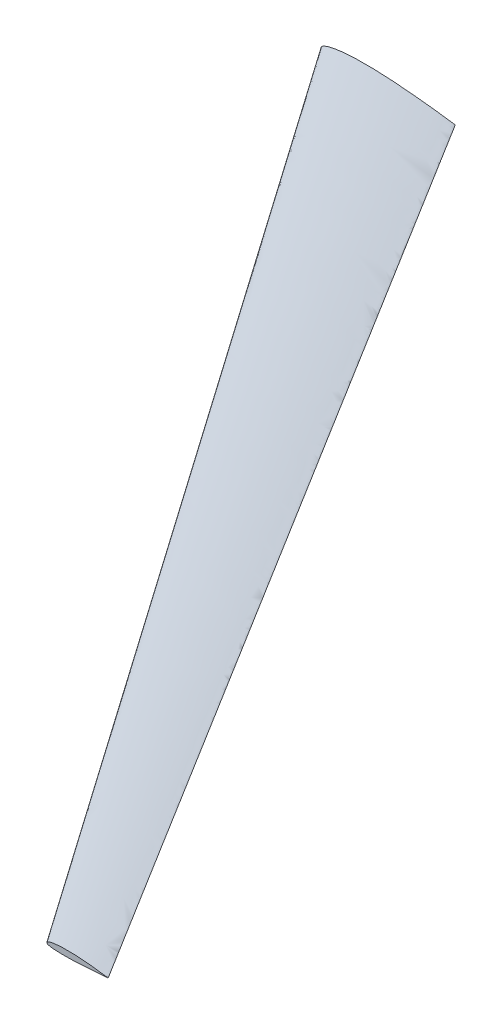
ISO-10303-21;
HEADER;
FILE_DESCRIPTION(('STEP AP214'),'2;1');
FILE_NAME('part.step','',(''),(''),'','','');
FILE_SCHEMA(('AUTOMOTIVE_DESIGN { 1 0 10303 214 1 1 1 1 }'));
ENDSEC;
DATA;
#1=APPLICATION_CONTEXT('core data for automotive mechanical design processes');
#2=APPLICATION_PROTOCOL_DEFINITION('international standard','automotive_design',2000,#1);
#3=PRODUCT_CONTEXT('',#1,'mechanical');
#4=PRODUCT('Part','Part','',(#3));
#5=PRODUCT_RELATED_PRODUCT_CATEGORY('part','',(#4));
#6=PRODUCT_DEFINITION_FORMATION('','',#4);
#7=PRODUCT_DEFINITION_CONTEXT('part definition',#1,'design');
#8=PRODUCT_DEFINITION('design','',#6,#7);
#9=PRODUCT_DEFINITION_SHAPE('','',#8);
#10=(LENGTH_UNIT() NAMED_UNIT(*) SI_UNIT(.MILLI.,.METRE.));
#11=(NAMED_UNIT(*) PLANE_ANGLE_UNIT() SI_UNIT($,.RADIAN.));
#12=(NAMED_UNIT(*) SI_UNIT($,.STERADIAN.) SOLID_ANGLE_UNIT());
#13=UNCERTAINTY_MEASURE_WITH_UNIT(LENGTH_MEASURE(1.E-05),#10,'distance_accuracy_value','');
#14=(GEOMETRIC_REPRESENTATION_CONTEXT(3) GLOBAL_UNCERTAINTY_ASSIGNED_CONTEXT((#13)) GLOBAL_UNIT_ASSIGNED_CONTEXT((#10,
#11,#12)) REPRESENTATION_CONTEXT('',''));
#15=CARTESIAN_POINT('',(0.,0.,0.));
#16=DIRECTION('',(0.,0.,1.));
#17=DIRECTION('',(1.,0.,0.));
#18=AXIS2_PLACEMENT_3D('',#15,#16,#17);
#19=CARTESIAN_POINT('',(0.855667075825416,7.96134139161861,0.));
#20=CARTESIAN_POINT('',(19781.0314944625,5.99054858424798,28285.44));
#21=CARTESIAN_POINT('',(0.173574208352584,4.71967273400761,0.));
#22=CARTESIAN_POINT('',(19780.5381772919,4.51007121518561,28285.44));
#23=CARTESIAN_POINT('',(-0.27109190079699,-0.233105194111028,0.));
#24=CARTESIAN_POINT('',(19780.0354140521,2.24000019906989,28285.44));
#25=CARTESIAN_POINT('',(3.18736665506327,-28.020616570806,0.));
#26=CARTESIAN_POINT('',(19779.7265660414,-10.566897723774,28285.44));
#27=CARTESIAN_POINT('',(32.7506798520964,-52.3537262762117,0.));
#28=CARTESIAN_POINT('',(19792.4115324319,-22.0264302888561,28285.44));
#29=CARTESIAN_POINT('',(74.9209681630601,-75.6191583224738,0.));
#30=CARTESIAN_POINT('',(19811.8684157215,-33.526964302491,28285.44));
#31=CARTESIAN_POINT('',(93.9449736122641,-82.5071599403052,0.));
#32=CARTESIAN_POINT('',(19820.5801868459,-36.9023963471957,28285.44));
#33=CARTESIAN_POINT('',(143.801794398069,-98.6354154872961,0.));
#34=CARTESIAN_POINT('',(19843.2373479585,-44.4021268837838,28285.44));
#35=CARTESIAN_POINT('',(181.45572574974,-108.346526058579,0.));
#36=CARTESIAN_POINT('',(19860.4108129047,-48.9338546159507,28285.44));
#37=CARTESIAN_POINT('',(250.045123161629,-122.619748644487,0.));
#38=CARTESIAN_POINT('',(19891.794583689,-55.6307534775961,28285.44));
#39=CARTESIAN_POINT('',(286.677210030328,-128.513403405488,0.));
#40=CARTESIAN_POINT('',(19908.5494259705,-58.3903997303687,28285.44));
#41=CARTESIAN_POINT('',(354.283554283496,-137.950628243872,0.));
#42=CARTESIAN_POINT('',(19939.4593511972,-62.7764405484861,28285.44));
#43=CARTESIAN_POINT('',(390.94855995957,-142.313337751785,0.));
#44=CARTESIAN_POINT('',(19956.2267387982,-64.8056917167518,28285.44));
#45=CARTESIAN_POINT('',(492.900772574759,-152.788732992669,0.));
#46=CARTESIAN_POINT('',(20002.8617561535,-69.6805560334725,28285.44));
#47=CARTESIAN_POINT('',(564.04455586065,-157.839859151007,0.));
#48=CARTESIAN_POINT('',(20035.4054985675,-72.0365463243244,28285.44));
#49=CARTESIAN_POINT('',(700.400706621572,-165.024665243742,0.));
#50=CARTESIAN_POINT('',(20097.7818866202,-75.3864498019501,28285.44));
#51=CARTESIAN_POINT('',(771.369214224914,-167.486001771823,0.));
#52=CARTESIAN_POINT('',(20130.2472949735,-76.5395222630629,28285.44));
#53=CARTESIAN_POINT('',(907.41771689154,-170.594944036233,0.));
#54=CARTESIAN_POINT('',(20192.4857275904,-78.0027473905018,28285.44));
#55=CARTESIAN_POINT('',(978.26254668309,-171.379560710498,0.));
#56=CARTESIAN_POINT('',(20224.8955181463,-78.3822981899831,28285.44));
#57=CARTESIAN_POINT('',(1114.13422964383,-171.389363920245,0.));
#58=CARTESIAN_POINT('',(20287.0539714694,-78.424933352916,28285.44));
#59=CARTESIAN_POINT('',(1184.92777692299,-170.644232874898,0.));
#60=CARTESIAN_POINT('',(20319.4404092474,-78.0910069857888,28285.44));
#61=CARTESIAN_POINT('',(1389.60866096464,-169.165888649532,0.));
#62=CARTESIAN_POINT('',(20413.0768840816,-77.3974410703995,28285.44));
#63=CARTESIAN_POINT('',(1529.28190722515,-169.005596140723,0.));
#64=CARTESIAN_POINT('',(20476.9748354596,-77.346002345635,28285.44));
#65=CARTESIAN_POINT('',(1803.33416018307,-160.148212848496,0.));
#66=CARTESIAN_POINT('',(20602.35043628,-73.4030358777167,28285.44));
#67=CARTESIAN_POINT('',(1943.47581643566,-151.297644330972,0.));
#68=CARTESIAN_POINT('',(20666.4633918548,-69.3751635186997,28285.44));
#69=CARTESIAN_POINT('',(2217.96608532329,-136.063950404044,0.));
#70=CARTESIAN_POINT('',(20792.0387436692,-62.3792468895826,28285.44));
#71=CARTESIAN_POINT('',(2358.07649479286,-129.333474626354,0.));
#72=CARTESIAN_POINT('',(20856.1342571492,-59.3001999449248,28285.44));
#73=CARTESIAN_POINT('',(2633.47911516551,-114.024710485586,0.));
#74=CARTESIAN_POINT('',(20982.1152890094,-52.3236347794506,28285.44));
#75=CARTESIAN_POINT('',(2774.51194448039,-105.133741454856,0.));
#76=CARTESIAN_POINT('',(21046.6428189532,-48.2650364997992,28285.44));
#77=CARTESIAN_POINT('',(3047.73745054737,-87.0953659051775,0.));
#78=CARTESIAN_POINT('',(21171.6789105128,-40.0205815926154,28285.44));
#79=CARTESIAN_POINT('',(3185.74738154801,-77.5688801540968,0.));
#80=CARTESIAN_POINT('',(21234.787263162,-35.666761491752,28285.44));
#81=CARTESIAN_POINT('',(3468.34262376373,-58.1563239321279,0.));
#82=CARTESIAN_POINT('',(21363.9164644842,-26.7952359553752,28285.44));
#83=CARTESIAN_POINT('',(3618.44636246257,-47.8636767469488,0.));
#84=CARTESIAN_POINT('',(21432.6922909026,-22.0913127696564,28285.44));
#85=CARTESIAN_POINT('',(3804.83511267659,-32.2194043588544,0.));
#86=CARTESIAN_POINT('',(21518.3877512215,-14.9413339031721,28285.44));
#87=CARTESIAN_POINT('',(3864.52495863128,-26.7054566774154,0.));
#88=CARTESIAN_POINT('',(21545.3661476597,-12.4236192330253,28285.44));
#89=CARTESIAN_POINT('',(4040.61084072262,-15.5534418083863,0.));
#90=CARTESIAN_POINT('',(21624.3744972191,-7.33564802142991,28285.44));
#91=CARTESIAN_POINT('',(4160.36149472117,-9.34556639482896,0.));
#92=CARTESIAN_POINT('',(21680.2979240753,-4.54895051359294,28285.44));
#93=CARTESIAN_POINT('',(4154.51823443592,10.1567914579562,0.));
#94=CARTESIAN_POINT('',(21683.5529497509,4.18225982961827,28285.44));
#95=CARTESIAN_POINT('',(4032.88645646596,24.0877434358918,0.));
#96=CARTESIAN_POINT('',(21629.0511145709,10.5384389484092,28285.44));
#97=CARTESIAN_POINT('',(3861.04810534186,45.7988762085699,0.));
#98=CARTESIAN_POINT('',(21548.8972232063,20.5963425728074,28285.44));
#99=CARTESIAN_POINT('',(3802.42725300228,54.576489180865,0.));
#100=CARTESIAN_POINT('',(21521.752570971,24.643454569566,28285.44));
#101=CARTESIAN_POINT('',(3615.93812837918,80.2102430012415,0.));
#102=CARTESIAN_POINT('',(21436.8662025719,36.3639471254189,28285.44));
#103=CARTESIAN_POINT('',(3466.00312536692,98.0112832967651,0.));
#104=CARTESIAN_POINT('',(21368.3822169842,44.5150712165527,28285.44));
#105=CARTESIAN_POINT('',(3184.15785576282,129.859366062384,0.));
#106=CARTESIAN_POINT('',(21239.2950844069,59.1229335134792,28285.44));
#107=CARTESIAN_POINT('',(3046.26194057482,144.577499216781,0.));
#108=CARTESIAN_POINT('',(21176.1838600514,65.8728882805657,28285.44));
#109=CARTESIAN_POINT('',(2772.71474240057,171.225351336154,0.));
#110=CARTESIAN_POINT('',(21051.0857869895,78.0911966023717,28285.44));
#111=CARTESIAN_POINT('',(2631.39298036355,183.708312597808,0.));
#112=CARTESIAN_POINT('',(20986.4432384999,83.817516843292,28285.44));
#113=CARTESIAN_POINT('',(2355.27987043134,205.480993998172,0.));
#114=CARTESIAN_POINT('',(20860.119284475,93.811815828136,28285.44));
#115=CARTESIAN_POINT('',(2214.7214985804,215.22320644395,0.));
#116=CARTESIAN_POINT('',(20795.81616224,98.2875516526073,28285.44));
#117=CARTESIAN_POINT('',(1939.01098742999,231.120701004463,0.));
#118=CARTESIAN_POINT('',(20669.6899696247,105.600537861482,28285.44));
#119=CARTESIAN_POINT('',(1798.10692799092,237.599945302375,0.));
#120=CARTESIAN_POINT('',(20605.2311618516,108.589617369566,28285.44));
#121=CARTESIAN_POINT('',(1521.56070842176,245.74972634535,0.));
#122=CARTESIAN_POINT('',(20478.7187123941,112.375653249475,28285.44));
#123=CARTESIAN_POINT('',(1312.33558604385,248.425476523081,0.));
#124=CARTESIAN_POINT('',(20383.0030047142,113.65618831702,28285.44));
#125=CARTESIAN_POINT('',(1103.18861108482,242.94031119637,0.));
#126=CARTESIAN_POINT('',(20287.3215723656,111.2208405313,28285.44));
#127=CARTESIAN_POINT('',(963.794528267862,237.301186370225,0.));
#128=CARTESIAN_POINT('',(20223.5499481601,108.6896962236,28285.44));
#129=CARTESIAN_POINT('',(824.35191731473,229.705550532832,0.));
#130=CARTESIAN_POINT('',(20159.7547596758,105.272839739836,28285.44));
#131=CARTESIAN_POINT('',(685.271275034728,216.841616245789,0.));
#132=CARTESIAN_POINT('',(20096.1219662646,99.4630860138433,28285.44));
#133=CARTESIAN_POINT('',(546.240321738396,200.621632438869,0.));
#134=CARTESIAN_POINT('',(20032.5088955694,92.1242662269565,28285.44));
#135=CARTESIAN_POINT('',(474.89063193822,190.572913554202,0.));
#136=CARTESIAN_POINT('',(19999.8602621943,87.582870214869,28285.44));
#137=CARTESIAN_POINT('',(373.008119494793,172.163835170675,0.));
#138=CARTESIAN_POINT('',(19953.236075191,79.2608353070979,28285.44));
#139=CARTESIAN_POINT('',(336.49467599241,164.819461398137,0.));
#140=CARTESIAN_POINT('',(19936.5222234222,75.9395923942,28285.44));
#141=CARTESIAN_POINT('',(269.32426798636,149.662424553158,0.));
#142=CARTESIAN_POINT('',(19905.7671888747,69.0824090279276,28285.44));
#143=CARTESIAN_POINT('',(233.04783555503,140.509295692551,0.));
#144=CARTESIAN_POINT('',(19889.1612419433,64.9633375612106,28285.44));
#145=CARTESIAN_POINT('',(165.506392816735,119.821500668317,0.));
#146=CARTESIAN_POINT('',(19858.2506018319,55.676179952762,28285.44));
#147=CARTESIAN_POINT('',(128.814244651755,106.516013183091,0.));
#148=CARTESIAN_POINT('',(19841.403140201,49.6776248827243,28285.44));
#149=CARTESIAN_POINT('',(80.7703924916429,85.5420232957702,0.));
#150=CARTESIAN_POINT('',(19819.260544032,40.1945858798813,28285.44));
#151=CARTESIAN_POINT('',(62.4451191587832,76.3966479437447,0.));
#152=CARTESIAN_POINT('',(19810.8626596056,36.2386265829033,28285.44));
#153=CARTESIAN_POINT('',(25.6581469952033,49.5602491270922,0.));
#154=CARTESIAN_POINT('',(19794.1031716761,24.7705736035399,28285.44));
#155=CARTESIAN_POINT('',(5.04941994329686,27.8922890331286,0.));
#156=CARTESIAN_POINT('',(19784.064586285,15.093057212927,28285.44));
#157=CARTESIAN_POINT('',(0.855667075825416,7.96134139161861,0.));
#158=CARTESIAN_POINT('',(19781.0314944625,5.99054858424798,28285.44));
#159=B_SPLINE_SURFACE_WITH_KNOTS('',3,1,((#19,#20),(#21,#22),(#23,#24),(#25,#26),(#27,#28),(#29,
#30),(#31,#32),(#33,#34),(#35,#36),(#37,#38),(#39,#40),(#41,#42),(#43,#44),(#45,#46),(#47,#48),
(#49,#50),(#51,#52),(#53,#54),(#55,#56),(#57,#58),(#59,#60),(#61,#62),(#63,#64),(#65,#66),(#67,
#68),(#69,#70),(#71,#72),(#73,#74),(#75,#76),(#77,#78),(#79,#80),(#81,#82),(#83,#84),(#85,#86),
(#87,#88),(#89,#90),(#91,#92),(#93,#94),(#95,#96),(#97,#98),(#99,#100),(#101,#102),(#103,#104),
(#105,#106),(#107,#108),(#109,#110),(#111,#112),(#113,#114),(#115,#116),(#117,#118),(#119,#120),
(#121,#122),(#123,#124),(#125,#126),(#127,#128),(#129,#130),(#131,#132),(#133,#134),(#135,#136),
(#137,#138),(#139,#140),(#141,#142),(#143,#144),(#145,#146),(#147,#148),(#149,#150),(#151,#152),
(#153,#154),(#155,#156),(#157,#158)),.UNSPECIFIED.,.T.,.F.,.F.,(4,1,1,1,1,1,1,1,1,1,1,1,1,1,1,1,
1,1,1,1,1,1,1,1,1,1,1,1,1,1,1,1,1,1,1,1,1,1,1,1,1,1,1,1,1,1,1,1,1,1,1,1,1,1,1,1,1,1,1,1,1,1,1,1,
1,1,1,4),(2,2),(0.,0.0012950545922763,0.00197901835868342,0.0112229565292596,0.0119069202956668,
0.0180552673524218,0.0187392311188289,0.0309526898042322,0.0316366535706393,0.0435205739603852,
0.0442045377267923,0.0559592654770019,0.056643229243409,0.0806521163328441,0.0813360800992512,
0.105231145291642,0.105915109058049,0.129755207161869,0.130439170928276,0.154263052662359,
0.154947016428766,0.203267292112445,0.203951255878852,0.252515863628961,0.253199827395368,
0.301810893137411,0.302494856903818,0.351169086130564,0.351853049896971,0.400601967195144,
0.401285930961551,0.450117068304261,0.450801032070668,0.474910901184663,0.47559486495107,
0.499798262135291,0.500482225901698,0.524690546806564,0.525374510572971,0.54951008060624,
0.550194044372647,0.599117907891133,0.59980187165754,0.648696749656019,0.649380713422426,
0.6982458253636,0.698929789130007,0.74775855182711,0.748442515593517,0.797242660637253,
0.79792662440366,0.84686680155808,0.8716785607472,0.872362524513607,0.896504992113342,
0.921361918190206,0.922045881956613,0.946308631049997,0.946992594816404,0.958862104743533,
0.95954606850994,0.971533734811574,0.972217698577981,0.984501070972848,0.985185034739255,
0.991353573687967,0.992037537454374,1.),(0.,1.),.UNSPECIFIED.);
#160=CARTESIAN_POINT('',(0.855667075825416,7.96134139161861,0.));
#161=CARTESIAN_POINT('',(0.173574208352584,4.71967273400761,0.));
#162=CARTESIAN_POINT('',(-0.27109190079699,-0.233105194111028,0.));
#163=CARTESIAN_POINT('',(3.18736665506327,-28.020616570806,0.));
#164=CARTESIAN_POINT('',(32.7506798520964,-52.3537262762117,0.));
#165=CARTESIAN_POINT('',(74.9209681630601,-75.6191583224738,0.));
#166=CARTESIAN_POINT('',(93.9449736122641,-82.5071599403052,0.));
#167=CARTESIAN_POINT('',(143.801794398069,-98.6354154872961,0.));
#168=CARTESIAN_POINT('',(181.45572574974,-108.346526058579,0.));
#169=CARTESIAN_POINT('',(250.045123161629,-122.619748644487,0.));
#170=CARTESIAN_POINT('',(286.677210030328,-128.513403405488,0.));
#171=CARTESIAN_POINT('',(354.283554283496,-137.950628243872,0.));
#172=CARTESIAN_POINT('',(390.94855995957,-142.313337751785,0.));
#173=CARTESIAN_POINT('',(492.900772574759,-152.788732992669,0.));
#174=CARTESIAN_POINT('',(564.04455586065,-157.839859151007,0.));
#175=CARTESIAN_POINT('',(700.400706621572,-165.024665243742,0.));
#176=CARTESIAN_POINT('',(771.369214224914,-167.486001771823,0.));
#177=CARTESIAN_POINT('',(907.41771689154,-170.594944036233,0.));
#178=CARTESIAN_POINT('',(978.26254668309,-171.379560710498,0.));
#179=CARTESIAN_POINT('',(1114.13422964383,-171.389363920245,0.));
#180=CARTESIAN_POINT('',(1184.92777692299,-170.644232874898,0.));
#181=CARTESIAN_POINT('',(1389.60866096464,-169.165888649532,0.));
#182=CARTESIAN_POINT('',(1529.28190722515,-169.005596140723,0.));
#183=CARTESIAN_POINT('',(1803.33416018307,-160.148212848496,0.));
#184=CARTESIAN_POINT('',(1943.47581643566,-151.297644330972,0.));
#185=CARTESIAN_POINT('',(2217.96608532329,-136.063950404044,0.));
#186=CARTESIAN_POINT('',(2358.07649479286,-129.333474626354,0.));
#187=CARTESIAN_POINT('',(2633.47911516551,-114.024710485586,0.));
#188=CARTESIAN_POINT('',(2774.51194448039,-105.133741454856,0.));
#189=CARTESIAN_POINT('',(3047.73745054737,-87.0953659051775,0.));
#190=CARTESIAN_POINT('',(3185.74738154801,-77.5688801540968,0.));
#191=CARTESIAN_POINT('',(3468.34262376373,-58.1563239321279,0.));
#192=CARTESIAN_POINT('',(3618.44636246257,-47.8636767469488,0.));
#193=CARTESIAN_POINT('',(3804.83511267659,-32.2194043588544,0.));
#194=CARTESIAN_POINT('',(3864.52495863128,-26.7054566774154,0.));
#195=CARTESIAN_POINT('',(4040.61084072262,-15.5534418083863,0.));
#196=CARTESIAN_POINT('',(4160.36149472117,-9.34556639482896,0.));
#197=CARTESIAN_POINT('',(4154.51823443592,10.1567914579562,0.));
#198=CARTESIAN_POINT('',(4032.88645646596,24.0877434358918,0.));
#199=CARTESIAN_POINT('',(3861.04810534186,45.7988762085699,0.));
#200=CARTESIAN_POINT('',(3802.42725300228,54.576489180865,0.));
#201=CARTESIAN_POINT('',(3615.93812837918,80.2102430012415,0.));
#202=CARTESIAN_POINT('',(3466.00312536692,98.0112832967651,0.));
#203=CARTESIAN_POINT('',(3184.15785576282,129.859366062384,0.));
#204=CARTESIAN_POINT('',(3046.26194057482,144.577499216781,0.));
#205=CARTESIAN_POINT('',(2772.71474240057,171.225351336154,0.));
#206=CARTESIAN_POINT('',(2631.39298036355,183.708312597808,0.));
#207=CARTESIAN_POINT('',(2355.27987043134,205.480993998172,0.));
#208=CARTESIAN_POINT('',(2214.7214985804,215.22320644395,0.));
#209=CARTESIAN_POINT('',(1939.01098742999,231.120701004463,0.));
#210=CARTESIAN_POINT('',(1798.10692799092,237.599945302375,0.));
#211=CARTESIAN_POINT('',(1521.56070842176,245.74972634535,0.));
#212=CARTESIAN_POINT('',(1312.33558604385,248.425476523081,0.));
#213=CARTESIAN_POINT('',(1103.18861108482,242.94031119637,0.));
#214=CARTESIAN_POINT('',(963.794528267862,237.301186370225,0.));
#215=CARTESIAN_POINT('',(824.35191731473,229.705550532832,0.));
#216=CARTESIAN_POINT('',(685.271275034728,216.841616245789,0.));
#217=CARTESIAN_POINT('',(546.240321738396,200.621632438869,0.));
#218=CARTESIAN_POINT('',(474.89063193822,190.572913554202,0.));
#219=CARTESIAN_POINT('',(373.008119494793,172.163835170675,0.));
#220=CARTESIAN_POINT('',(336.49467599241,164.819461398137,0.));
#221=CARTESIAN_POINT('',(269.32426798636,149.662424553158,0.));
#222=CARTESIAN_POINT('',(233.04783555503,140.509295692551,0.));
#223=CARTESIAN_POINT('',(165.506392816735,119.821500668317,0.));
#224=CARTESIAN_POINT('',(128.814244651755,106.516013183091,0.));
#225=CARTESIAN_POINT('',(80.7703924916429,85.5420232957702,0.));
#226=CARTESIAN_POINT('',(62.4451191587832,76.3966479437447,0.));
#227=CARTESIAN_POINT('',(25.6581469952033,49.5602491270922,0.));
#228=CARTESIAN_POINT('',(5.04941994329686,27.8922890331286,0.));
#229=CARTESIAN_POINT('',(0.855667075825416,7.96134139161861,0.));
#230=B_SPLINE_CURVE_WITH_KNOTS('',3,(#160,#161,#162,#163,#164,#165,#166,#167,#168,#169,#170,
#171,#172,#173,#174,#175,#176,#177,#178,#179,#180,#181,#182,#183,#184,#185,#186,#187,#188,#189,
#190,#191,#192,#193,#194,#195,#196,#197,#198,#199,#200,#201,#202,#203,#204,#205,#206,#207,#208,
#209,#210,#211,#212,#213,#214,#215,#216,#217,#218,#219,#220,#221,#222,#223,#224,#225,#226,#227,
#228,#229),.UNSPECIFIED.,.T.,.F.,(4,1,1,1,1,1,1,1,1,1,1,1,1,1,1,1,1,1,1,1,1,1,1,1,1,1,1,1,1,1,1,
1,1,1,1,1,1,1,1,1,1,1,1,1,1,1,1,1,1,1,1,1,1,1,1,1,1,1,1,1,1,1,1,1,1,1,1,4),(0.,
0.0012950545922763,0.00197901835868342,0.0112229565292596,0.0119069202956668,0.0180552673524218,
0.0187392311188289,0.0309526898042322,0.0316366535706393,0.0435205739603852,0.0442045377267923,
0.0559592654770019,0.056643229243409,0.0806521163328441,0.0813360800992512,0.105231145291642,
0.105915109058049,0.129755207161869,0.130439170928276,0.154263052662359,0.154947016428766,
0.203267292112445,0.203951255878852,0.252515863628961,0.253199827395368,0.301810893137411,
0.302494856903818,0.351169086130564,0.351853049896971,0.400601967195144,0.401285930961551,
0.450117068304261,0.450801032070668,0.474910901184663,0.47559486495107,0.499798262135291,
0.500482225901698,0.524690546806564,0.525374510572971,0.54951008060624,0.550194044372647,
0.599117907891133,0.59980187165754,0.648696749656019,0.649380713422426,0.6982458253636,
0.698929789130007,0.74775855182711,0.748442515593517,0.797242660637253,0.79792662440366,
0.84686680155808,0.8716785607472,0.872362524513607,0.896504992113342,0.921361918190206,
0.922045881956613,0.946308631049997,0.946992594816404,0.958862104743533,0.95954606850994,
0.971533734811574,0.972217698577981,0.984501070972848,0.985185034739255,0.991353573687967,
0.992037537454374,1.),.UNSPECIFIED.);
#231=CARTESIAN_POINT('',(0.855667075825416,7.96134139161861,0.));
#232=VERTEX_POINT('',#231);
#233=EDGE_CURVE('E11',#232,#232,#230,.T.);
#234=CARTESIAN_POINT('',(19781.0314944625,5.99054858424798,28285.44));
#235=CARTESIAN_POINT('',(19780.5381772919,4.51007121518561,28285.44));
#236=CARTESIAN_POINT('',(19780.0354140521,2.24000019906989,28285.44));
#237=CARTESIAN_POINT('',(19779.7265660414,-10.566897723774,28285.44));
#238=CARTESIAN_POINT('',(19792.4115324319,-22.0264302888561,28285.44));
#239=CARTESIAN_POINT('',(19811.8684157215,-33.526964302491,28285.44));
#240=CARTESIAN_POINT('',(19820.5801868459,-36.9023963471957,28285.44));
#241=CARTESIAN_POINT('',(19843.2373479585,-44.4021268837838,28285.44));
#242=CARTESIAN_POINT('',(19860.4108129047,-48.9338546159507,28285.44));
#243=CARTESIAN_POINT('',(19891.794583689,-55.6307534775961,28285.44));
#244=CARTESIAN_POINT('',(19908.5494259705,-58.3903997303687,28285.44));
#245=CARTESIAN_POINT('',(19939.4593511972,-62.7764405484861,28285.44));
#246=CARTESIAN_POINT('',(19956.2267387982,-64.8056917167518,28285.44));
#247=CARTESIAN_POINT('',(20002.8617561535,-69.6805560334725,28285.44));
#248=CARTESIAN_POINT('',(20035.4054985675,-72.0365463243244,28285.44));
#249=CARTESIAN_POINT('',(20097.7818866202,-75.3864498019501,28285.44));
#250=CARTESIAN_POINT('',(20130.2472949735,-76.5395222630629,28285.44));
#251=CARTESIAN_POINT('',(20192.4857275904,-78.0027473905018,28285.44));
#252=CARTESIAN_POINT('',(20224.8955181463,-78.3822981899831,28285.44));
#253=CARTESIAN_POINT('',(20287.0539714694,-78.424933352916,28285.44));
#254=CARTESIAN_POINT('',(20319.4404092474,-78.0910069857888,28285.44));
#255=CARTESIAN_POINT('',(20413.0768840816,-77.3974410703995,28285.44));
#256=CARTESIAN_POINT('',(20476.9748354596,-77.346002345635,28285.44));
#257=CARTESIAN_POINT('',(20602.35043628,-73.4030358777167,28285.44));
#258=CARTESIAN_POINT('',(20666.4633918548,-69.3751635186997,28285.44));
#259=CARTESIAN_POINT('',(20792.0387436692,-62.3792468895826,28285.44));
#260=CARTESIAN_POINT('',(20856.1342571492,-59.3001999449248,28285.44));
#261=CARTESIAN_POINT('',(20982.1152890094,-52.3236347794506,28285.44));
#262=CARTESIAN_POINT('',(21046.6428189532,-48.2650364997992,28285.44));
#263=CARTESIAN_POINT('',(21171.6789105128,-40.0205815926154,28285.44));
#264=CARTESIAN_POINT('',(21234.787263162,-35.666761491752,28285.44));
#265=CARTESIAN_POINT('',(21363.9164644842,-26.7952359553752,28285.44));
#266=CARTESIAN_POINT('',(21432.6922909026,-22.0913127696564,28285.44));
#267=CARTESIAN_POINT('',(21518.3877512215,-14.9413339031721,28285.44));
#268=CARTESIAN_POINT('',(21545.3661476597,-12.4236192330253,28285.44));
#269=CARTESIAN_POINT('',(21624.3744972191,-7.33564802142991,28285.44));
#270=CARTESIAN_POINT('',(21680.2979240753,-4.54895051359294,28285.44));
#271=CARTESIAN_POINT('',(21683.5529497509,4.18225982961827,28285.44));
#272=CARTESIAN_POINT('',(21629.0511145709,10.5384389484092,28285.44));
#273=CARTESIAN_POINT('',(21548.8972232063,20.5963425728074,28285.44));
#274=CARTESIAN_POINT('',(21521.752570971,24.643454569566,28285.44));
#275=CARTESIAN_POINT('',(21436.8662025719,36.3639471254189,28285.44));
#276=CARTESIAN_POINT('',(21368.3822169842,44.5150712165527,28285.44));
#277=CARTESIAN_POINT('',(21239.2950844069,59.1229335134792,28285.44));
#278=CARTESIAN_POINT('',(21176.1838600514,65.8728882805657,28285.44));
#279=CARTESIAN_POINT('',(21051.0857869895,78.0911966023717,28285.44));
#280=CARTESIAN_POINT('',(20986.4432384999,83.817516843292,28285.44));
#281=CARTESIAN_POINT('',(20860.119284475,93.811815828136,28285.44));
#282=CARTESIAN_POINT('',(20795.81616224,98.2875516526073,28285.44));
#283=CARTESIAN_POINT('',(20669.6899696247,105.600537861482,28285.44));
#284=CARTESIAN_POINT('',(20605.2311618516,108.589617369566,28285.44));
#285=CARTESIAN_POINT('',(20478.7187123941,112.375653249475,28285.44));
#286=CARTESIAN_POINT('',(20383.0030047142,113.65618831702,28285.44));
#287=CARTESIAN_POINT('',(20287.3215723656,111.2208405313,28285.44));
#288=CARTESIAN_POINT('',(20223.5499481601,108.6896962236,28285.44));
#289=CARTESIAN_POINT('',(20159.7547596758,105.272839739836,28285.44));
#290=CARTESIAN_POINT('',(20096.1219662646,99.4630860138433,28285.44));
#291=CARTESIAN_POINT('',(20032.5088955694,92.1242662269565,28285.44));
#292=CARTESIAN_POINT('',(19999.8602621943,87.582870214869,28285.44));
#293=CARTESIAN_POINT('',(19953.236075191,79.2608353070979,28285.44));
#294=CARTESIAN_POINT('',(19936.5222234222,75.9395923942,28285.44));
#295=CARTESIAN_POINT('',(19905.7671888747,69.0824090279276,28285.44));
#296=CARTESIAN_POINT('',(19889.1612419433,64.9633375612106,28285.44));
#297=CARTESIAN_POINT('',(19858.2506018319,55.676179952762,28285.44));
#298=CARTESIAN_POINT('',(19841.403140201,49.6776248827243,28285.44));
#299=CARTESIAN_POINT('',(19819.260544032,40.1945858798813,28285.44));
#300=CARTESIAN_POINT('',(19810.8626596056,36.2386265829033,28285.44));
#301=CARTESIAN_POINT('',(19794.1031716761,24.7705736035399,28285.44));
#302=CARTESIAN_POINT('',(19784.064586285,15.093057212927,28285.44));
#303=CARTESIAN_POINT('',(19781.0314944625,5.99054858424798,28285.44));
#304=B_SPLINE_CURVE_WITH_KNOTS('',3,(#234,#235,#236,#237,#238,#239,#240,#241,#242,#243,#244,
#245,#246,#247,#248,#249,#250,#251,#252,#253,#254,#255,#256,#257,#258,#259,#260,#261,#262,#263,
#264,#265,#266,#267,#268,#269,#270,#271,#272,#273,#274,#275,#276,#277,#278,#279,#280,#281,#282,
#283,#284,#285,#286,#287,#288,#289,#290,#291,#292,#293,#294,#295,#296,#297,#298,#299,#300,#301,
#302,#303),.UNSPECIFIED.,.T.,.F.,(4,1,1,1,1,1,1,1,1,1,1,1,1,1,1,1,1,1,1,1,1,1,1,1,1,1,1,1,1,1,1,
1,1,1,1,1,1,1,1,1,1,1,1,1,1,1,1,1,1,1,1,1,1,1,1,1,1,1,1,1,1,1,1,1,1,1,1,4),(0.,
0.0012950545922763,0.00197901835868342,0.0112229565292596,0.0119069202956668,0.0180552673524218,
0.0187392311188289,0.0309526898042322,0.0316366535706393,0.0435205739603852,0.0442045377267923,
0.0559592654770019,0.056643229243409,0.0806521163328441,0.0813360800992512,0.105231145291642,
0.105915109058049,0.129755207161869,0.130439170928276,0.154263052662359,0.154947016428766,
0.203267292112445,0.203951255878852,0.252515863628961,0.253199827395368,0.301810893137411,
0.302494856903818,0.351169086130564,0.351853049896971,0.400601967195144,0.401285930961551,
0.450117068304261,0.450801032070668,0.474910901184663,0.47559486495107,0.499798262135291,
0.500482225901698,0.524690546806564,0.525374510572971,0.54951008060624,0.550194044372647,
0.599117907891133,0.59980187165754,0.648696749656019,0.649380713422426,0.6982458253636,
0.698929789130007,0.74775855182711,0.748442515593517,0.797242660637253,0.79792662440366,
0.84686680155808,0.8716785607472,0.872362524513607,0.896504992113342,0.921361918190206,
0.922045881956613,0.946308631049997,0.946992594816404,0.958862104743533,0.95954606850994,
0.971533734811574,0.972217698577981,0.984501070972848,0.985185034739255,0.991353573687967,
0.992037537454374,1.),.UNSPECIFIED.);
#305=CARTESIAN_POINT('',(19781.0314944625,5.99054858424798,28285.44));
#306=VERTEX_POINT('',#305);
#307=EDGE_CURVE('E50',#306,#306,#304,.T.);
#308=ORIENTED_EDGE('',*,*,#233,.T.);
#309=EDGE_LOOP('',(#308));
#310=FACE_BOUND('',#309,.T.);
#311=ORIENTED_EDGE('',*,*,#307,.F.);
#312=EDGE_LOOP('',(#311));
#313=FACE_BOUND('',#312,.T.);
#314=ADVANCED_FACE('F46',(#310,#313),#159,.T.);
#315=CARTESIAN_POINT('',(1.20267053090447,9.47622080495111,0.));
#316=DIRECTION('',(0.,0.,-1.));
#317=DIRECTION('',(-1.,0.,0.));
#318=AXIS2_PLACEMENT_3D('',#315,#316,#317);
#319=PLANE('',#318);
#320=ORIENTED_EDGE('',*,*,#233,.F.);
#321=EDGE_LOOP('',(#320));
#322=FACE_BOUND('',#321,.T.);
#323=ADVANCED_FACE('F68',(#322),#319,.T.);
#324=CARTESIAN_POINT('',(19780.5501953162,4.33516259698557,28285.44));
#325=DIRECTION('',(0.,0.,-1.));
#326=DIRECTION('',(-1.,0.,0.));
#327=AXIS2_PLACEMENT_3D('',#324,#325,#326);
#328=PLANE('',#327);
#329=ORIENTED_EDGE('',*,*,#307,.T.);
#330=EDGE_LOOP('',(#329));
#331=FACE_BOUND('',#330,.T.);
#332=ADVANCED_FACE('F48',(#331),#328,.F.);
#333=CLOSED_SHELL('',(#314,#323,#332));
#334=MANIFOLD_SOLID_BREP('B2',#333);
#335=ADVANCED_BREP_SHAPE_REPRESENTATION('',(#18,#334),#14);
#336=SHAPE_DEFINITION_REPRESENTATION(#9,#335);
ENDSEC;
END-ISO-10303-21;
